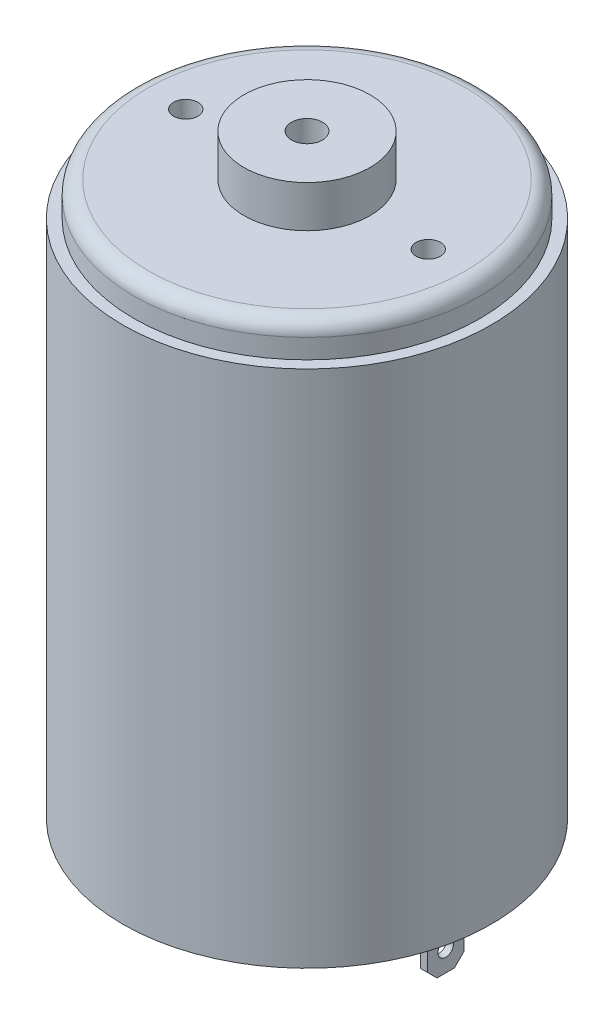
ISO-10303-21;
HEADER;
FILE_DESCRIPTION(('STEP AP214'),'2;1');
FILE_NAME('part.step','',(''),(''),'','','');
FILE_SCHEMA(('AUTOMOTIVE_DESIGN { 1 0 10303 214 1 1 1 1 }'));
ENDSEC;
DATA;
#1=APPLICATION_CONTEXT('core data for automotive mechanical design processes');
#2=APPLICATION_PROTOCOL_DEFINITION('international standard','automotive_design',2000,#1);
#3=PRODUCT_CONTEXT('',#1,'mechanical');
#4=PRODUCT('Part','Part','',(#3));
#5=PRODUCT_RELATED_PRODUCT_CATEGORY('part','',(#4));
#6=PRODUCT_DEFINITION_FORMATION('','',#4);
#7=PRODUCT_DEFINITION_CONTEXT('part definition',#1,'design');
#8=PRODUCT_DEFINITION('design','',#6,#7);
#9=PRODUCT_DEFINITION_SHAPE('','',#8);
#10=(LENGTH_UNIT() NAMED_UNIT(*) SI_UNIT(.MILLI.,.METRE.));
#11=(NAMED_UNIT(*) PLANE_ANGLE_UNIT() SI_UNIT($,.RADIAN.));
#12=(NAMED_UNIT(*) SI_UNIT($,.STERADIAN.) SOLID_ANGLE_UNIT());
#13=UNCERTAINTY_MEASURE_WITH_UNIT(LENGTH_MEASURE(1.E-05),#10,'distance_accuracy_value','');
#14=(GEOMETRIC_REPRESENTATION_CONTEXT(3) GLOBAL_UNCERTAINTY_ASSIGNED_CONTEXT((#13)) GLOBAL_UNIT_ASSIGNED_CONTEXT((#10,
#11,#12)) REPRESENTATION_CONTEXT('',''));
#15=CARTESIAN_POINT('',(0.,0.,0.));
#16=DIRECTION('',(0.,0.,1.));
#17=DIRECTION('',(1.,0.,0.));
#18=AXIS2_PLACEMENT_3D('',#15,#16,#17);
#19=CARTESIAN_POINT('',(-5.075,4.5,0.));
#20=DIRECTION('',(0.,1.,0.));
#21=DIRECTION('',(0.,0.,1.));
#22=AXIS2_PLACEMENT_3D('',#19,#20,#21);
#23=PLANE('',#22);
#24=DIRECTION('',(0.,0.,-1.));
#25=VECTOR('',#24,1.);
#26=CARTESIAN_POINT('',(-14.3,4.5,1.9));
#27=LINE('',#26,#25);
#28=CARTESIAN_POINT('',(-14.3,4.5,1.9));
#29=VERTEX_POINT('',#28);
#30=CARTESIAN_POINT('',(-14.3,4.5,-1.9));
#31=VERTEX_POINT('',#30);
#32=EDGE_CURVE('E181',#29,#31,#27,.T.);
#33=ORIENTED_EDGE('',*,*,#32,.F.);
#34=DIRECTION('',(-1.,0.,0.));
#35=VECTOR('',#34,1.);
#36=CARTESIAN_POINT('',(-14.3,4.5,1.9));
#37=LINE('',#36,#35);
#38=CARTESIAN_POINT('',(-13.6,4.5,1.9));
#39=VERTEX_POINT('',#38);
#40=EDGE_CURVE('E177',#39,#29,#37,.T.);
#41=ORIENTED_EDGE('',*,*,#40,.F.);
#42=DIRECTION('',(0.,0.,1.));
#43=VECTOR('',#42,1.);
#44=CARTESIAN_POINT('',(-13.6,4.5,1.9));
#45=LINE('',#44,#43);
#46=CARTESIAN_POINT('',(-13.6,4.5,-1.9));
#47=VERTEX_POINT('',#46);
#48=EDGE_CURVE('E187',#47,#39,#45,.T.);
#49=ORIENTED_EDGE('',*,*,#48,.F.);
#50=DIRECTION('',(1.,0.,0.));
#51=VECTOR('',#50,1.);
#52=CARTESIAN_POINT('',(-14.3,4.5,-1.9));
#53=LINE('',#52,#51);
#54=EDGE_CURVE('E184',#31,#47,#53,.T.);
#55=ORIENTED_EDGE('',*,*,#54,.F.);
#56=EDGE_LOOP('',(#33,#41,#49,#55));
#57=FACE_BOUND('',#56,.T.);
#58=CARTESIAN_POINT('',(0.,4.5,0.));
#59=DIRECTION('',(0.,-1.,0.));
#60=DIRECTION('',(0.,0.,-1.));
#61=AXIS2_PLACEMENT_3D('',#58,#59,#60);
#62=CIRCLE('',#61,5.075);
#63=CARTESIAN_POINT('',(0.,4.5,-5.075));
#64=VERTEX_POINT('',#63);
#65=EDGE_CURVE('E232',#64,#64,#62,.T.);
#66=ORIENTED_EDGE('',*,*,#65,.F.);
#67=EDGE_LOOP('',(#66));
#68=FACE_BOUND('',#67,.T.);
#69=CARTESIAN_POINT('',(0.,4.5,0.));
#70=DIRECTION('',(0.,-1.,0.));
#71=DIRECTION('',(0.,0.,-1.));
#72=AXIS2_PLACEMENT_3D('',#69,#70,#71);
#73=CIRCLE('',#72,19.);
#74=CARTESIAN_POINT('',(0.,4.5,-19.));
#75=VERTEX_POINT('',#74);
#76=EDGE_CURVE('E229',#75,#75,#73,.T.);
#77=ORIENTED_EDGE('',*,*,#76,.T.);
#78=EDGE_LOOP('',(#77));
#79=FACE_BOUND('',#78,.T.);
#80=DIRECTION('',(0.,0.,1.));
#81=VECTOR('',#80,1.);
#82=CARTESIAN_POINT('',(14.3,4.5,-1.9));
#83=LINE('',#82,#81);
#84=CARTESIAN_POINT('',(14.3,4.5,-1.9));
#85=VERTEX_POINT('',#84);
#86=CARTESIAN_POINT('',(14.3,4.5,1.9));
#87=VERTEX_POINT('',#86);
#88=EDGE_CURVE('E140',#85,#87,#83,.T.);
#89=ORIENTED_EDGE('',*,*,#88,.F.);
#90=DIRECTION('',(1.,0.,0.));
#91=VECTOR('',#90,1.);
#92=CARTESIAN_POINT('',(14.3,4.5,-1.9));
#93=LINE('',#92,#91);
#94=CARTESIAN_POINT('',(13.6,4.5,-1.9));
#95=VERTEX_POINT('',#94);
#96=EDGE_CURVE('E150',#95,#85,#93,.T.);
#97=ORIENTED_EDGE('',*,*,#96,.F.);
#98=DIRECTION('',(0.,0.,-1.));
#99=VECTOR('',#98,1.);
#100=CARTESIAN_POINT('',(13.6,4.5,-1.9));
#101=LINE('',#100,#99);
#102=CARTESIAN_POINT('',(13.6,4.5,1.9));
#103=VERTEX_POINT('',#102);
#104=EDGE_CURVE('E157',#103,#95,#101,.T.);
#105=ORIENTED_EDGE('',*,*,#104,.F.);
#106=DIRECTION('',(-1.,0.,0.));
#107=VECTOR('',#106,1.);
#108=CARTESIAN_POINT('',(14.3,4.5,1.9));
#109=LINE('',#108,#107);
#110=EDGE_CURVE('E153',#87,#103,#109,.T.);
#111=ORIENTED_EDGE('',*,*,#110,.F.);
#112=EDGE_LOOP('',(#89,#97,#105,#111));
#113=FACE_BOUND('',#112,.T.);
#114=ADVANCED_FACE('F40',(#57,#68,#79,#113),#23,.F.);
#115=CARTESIAN_POINT('',(-1.6,2.6,0.));
#116=DIRECTION('',(0.,1.,0.));
#117=DIRECTION('',(0.,0.,1.));
#118=AXIS2_PLACEMENT_3D('',#115,#116,#117);
#119=PLANE('',#118);
#120=CARTESIAN_POINT('',(0.,2.6,0.));
#121=DIRECTION('',(0.,1.,0.));
#122=DIRECTION('',(0.,0.,1.));
#123=AXIS2_PLACEMENT_3D('',#120,#121,#122);
#124=CIRCLE('',#123,1.6);
#125=CARTESIAN_POINT('',(0.,2.6,1.6));
#126=VERTEX_POINT('',#125);
#127=EDGE_CURVE('E415',#126,#126,#124,.T.);
#128=ORIENTED_EDGE('',*,*,#127,.T.);
#129=EDGE_LOOP('',(#128));
#130=FACE_BOUND('',#129,.T.);
#131=CARTESIAN_POINT('',(0.,2.6,0.));
#132=DIRECTION('',(0.,-1.,0.));
#133=DIRECTION('',(0.,0.,-1.));
#134=AXIS2_PLACEMENT_3D('',#131,#132,#133);
#135=CIRCLE('',#134,5.075);
#136=CARTESIAN_POINT('',(0.,2.6,-5.075));
#137=VERTEX_POINT('',#136);
#138=EDGE_CURVE('E235',#137,#137,#135,.T.);
#139=ORIENTED_EDGE('',*,*,#138,.T.);
#140=EDGE_LOOP('',(#139));
#141=FACE_BOUND('',#140,.T.);
#142=ADVANCED_FACE('F289',(#130,#141),#119,.F.);
#143=CARTESIAN_POINT('',(0.,0.,0.));
#144=DIRECTION('',(0.,-1.,0.));
#145=DIRECTION('',(0.,0.,-1.));
#146=AXIS2_PLACEMENT_3D('',#143,#144,#145);
#147=CYLINDRICAL_SURFACE('',#146,5.075);
#148=ORIENTED_EDGE('',*,*,#138,.F.);
#149=EDGE_LOOP('',(#148));
#150=FACE_BOUND('',#149,.T.);
#151=ORIENTED_EDGE('',*,*,#65,.T.);
#152=EDGE_LOOP('',(#151));
#153=FACE_BOUND('',#152,.T.);
#154=ADVANCED_FACE('F295',(#150,#153),#147,.T.);
#155=CARTESIAN_POINT('',(0.,0.,0.));
#156=DIRECTION('',(0.,-1.,0.));
#157=DIRECTION('',(0.,0.,-1.));
#158=AXIS2_PLACEMENT_3D('',#155,#156,#157);
#159=CYLINDRICAL_SURFACE('',#158,19.);
#160=ORIENTED_EDGE('',*,*,#76,.F.);
#161=EDGE_LOOP('',(#160));
#162=FACE_BOUND('',#161,.T.);
#163=CARTESIAN_POINT('',(0.,58.,0.));
#164=DIRECTION('',(0.,-1.,0.));
#165=DIRECTION('',(0.,0.,-1.));
#166=AXIS2_PLACEMENT_3D('',#163,#164,#165);
#167=CIRCLE('',#166,19.);
#168=CARTESIAN_POINT('',(0.,58.,-19.));
#169=VERTEX_POINT('',#168);
#170=EDGE_CURVE('E226',#169,#169,#167,.T.);
#171=ORIENTED_EDGE('',*,*,#170,.T.);
#172=EDGE_LOOP('',(#171));
#173=FACE_BOUND('',#172,.T.);
#174=ADVANCED_FACE('F302',(#162,#173),#159,.T.);
#175=CARTESIAN_POINT('',(-19.,58.,0.));
#176=DIRECTION('',(0.,-1.,0.));
#177=DIRECTION('',(0.,0.,-1.));
#178=AXIS2_PLACEMENT_3D('',#175,#176,#177);
#179=PLANE('',#178);
#180=ORIENTED_EDGE('',*,*,#170,.F.);
#181=EDGE_LOOP('',(#180));
#182=FACE_BOUND('',#181,.T.);
#183=CARTESIAN_POINT('',(0.,58.,0.));
#184=DIRECTION('',(0.,-1.,0.));
#185=DIRECTION('',(0.,0.,-1.));
#186=AXIS2_PLACEMENT_3D('',#183,#184,#185);
#187=CIRCLE('',#186,17.85);
#188=CARTESIAN_POINT('',(0.,58.,-17.85));
#189=VERTEX_POINT('',#188);
#190=EDGE_CURVE('E223',#189,#189,#187,.T.);
#191=ORIENTED_EDGE('',*,*,#190,.T.);
#192=EDGE_LOOP('',(#191));
#193=FACE_BOUND('',#192,.T.);
#194=ADVANCED_FACE('F390',(#182,#193),#179,.F.);
#195=CARTESIAN_POINT('',(0.,0.,0.));
#196=DIRECTION('',(0.,-1.,0.));
#197=DIRECTION('',(0.,0.,-1.));
#198=AXIS2_PLACEMENT_3D('',#195,#196,#197);
#199=CYLINDRICAL_SURFACE('',#198,17.85);
#200=ORIENTED_EDGE('',*,*,#190,.F.);
#201=EDGE_LOOP('',(#200));
#202=FACE_BOUND('',#201,.T.);
#203=CARTESIAN_POINT('',(0.,60.,0.));
#204=DIRECTION('',(0.,-1.,0.));
#205=DIRECTION('',(0.,0.,-1.));
#206=AXIS2_PLACEMENT_3D('',#203,#204,#205);
#207=CIRCLE('',#206,17.85);
#208=CARTESIAN_POINT('',(0.,60.,-17.85));
#209=VERTEX_POINT('',#208);
#210=EDGE_CURVE('E220',#209,#209,#207,.T.);
#211=ORIENTED_EDGE('',*,*,#210,.T.);
#212=EDGE_LOOP('',(#211));
#213=FACE_BOUND('',#212,.T.);
#214=ADVANCED_FACE('F387',(#202,#213),#199,.T.);
#215=CARTESIAN_POINT('',(0.,60.,0.));
#216=DIRECTION('',(0.,-1.,0.));
#217=DIRECTION('',(0.,0.,-1.));
#218=AXIS2_PLACEMENT_3D('',#215,#216,#217);
#219=TOROIDAL_SURFACE('',#218,16.35,1.5);
#220=ORIENTED_EDGE('',*,*,#210,.F.);
#221=EDGE_LOOP('',(#220));
#222=FACE_BOUND('',#221,.T.);
#223=CARTESIAN_POINT('',(0.,61.5,0.));
#224=DIRECTION('',(0.,-1.,0.));
#225=DIRECTION('',(0.,0.,-1.));
#226=AXIS2_PLACEMENT_3D('',#223,#224,#225);
#227=CIRCLE('',#226,16.35);
#228=CARTESIAN_POINT('',(0.,61.5,-16.35));
#229=VERTEX_POINT('',#228);
#230=EDGE_CURVE('E217',#229,#229,#227,.T.);
#231=ORIENTED_EDGE('',*,*,#230,.T.);
#232=EDGE_LOOP('',(#231));
#233=FACE_BOUND('',#232,.T.);
#234=ADVANCED_FACE('F383',(#222,#233),#219,.T.);
#235=CARTESIAN_POINT('',(-16.35,61.5,0.));
#236=DIRECTION('',(0.,-1.,0.));
#237=DIRECTION('',(0.,0.,-1.));
#238=AXIS2_PLACEMENT_3D('',#235,#236,#237);
#239=PLANE('',#238);
#240=CARTESIAN_POINT('',(-12.5,61.5,0.));
#241=DIRECTION('',(0.,1.,0.));
#242=DIRECTION('',(0.,0.,1.));
#243=AXIS2_PLACEMENT_3D('',#240,#241,#242);
#244=CIRCLE('',#243,1.25);
#245=CARTESIAN_POINT('',(-12.5,61.5,1.25));
#246=VERTEX_POINT('',#245);
#247=EDGE_CURVE('E199',#246,#246,#244,.T.);
#248=ORIENTED_EDGE('',*,*,#247,.F.);
#249=EDGE_LOOP('',(#248));
#250=FACE_BOUND('',#249,.T.);
#251=CARTESIAN_POINT('',(12.5,61.5,0.));
#252=DIRECTION('',(0.,1.,0.));
#253=DIRECTION('',(0.,0.,1.));
#254=AXIS2_PLACEMENT_3D('',#251,#252,#253);
#255=CIRCLE('',#254,1.25);
#256=CARTESIAN_POINT('',(12.5,61.5,1.24999999999999));
#257=VERTEX_POINT('',#256);
#258=EDGE_CURVE('E205',#257,#257,#255,.T.);
#259=ORIENTED_EDGE('',*,*,#258,.F.);
#260=EDGE_LOOP('',(#259));
#261=FACE_BOUND('',#260,.T.);
#262=ORIENTED_EDGE('',*,*,#230,.F.);
#263=EDGE_LOOP('',(#262));
#264=FACE_BOUND('',#263,.T.);
#265=CARTESIAN_POINT('',(0.,61.5,0.));
#266=DIRECTION('',(0.,-1.,0.));
#267=DIRECTION('',(0.,0.,-1.));
#268=AXIS2_PLACEMENT_3D('',#265,#266,#267);
#269=CIRCLE('',#268,6.5);
#270=CARTESIAN_POINT('',(0.,61.5,-6.5));
#271=VERTEX_POINT('',#270);
#272=EDGE_CURVE('E214',#271,#271,#269,.T.);
#273=ORIENTED_EDGE('',*,*,#272,.T.);
#274=EDGE_LOOP('',(#273));
#275=FACE_BOUND('',#274,.T.);
#276=ADVANCED_FACE('F379',(#250,#261,#264,#275),#239,.F.);
#277=CARTESIAN_POINT('',(0.,0.,0.));
#278=DIRECTION('',(0.,-1.,0.));
#279=DIRECTION('',(0.,0.,-1.));
#280=AXIS2_PLACEMENT_3D('',#277,#278,#279);
#281=CYLINDRICAL_SURFACE('',#280,6.5);
#282=ORIENTED_EDGE('',*,*,#272,.F.);
#283=EDGE_LOOP('',(#282));
#284=FACE_BOUND('',#283,.T.);
#285=CARTESIAN_POINT('',(0.,65.8,0.));
#286=DIRECTION('',(0.,-1.,0.));
#287=DIRECTION('',(0.,0.,-1.));
#288=AXIS2_PLACEMENT_3D('',#285,#286,#287);
#289=CIRCLE('',#288,6.5);
#290=CARTESIAN_POINT('',(0.,65.8,-6.5));
#291=VERTEX_POINT('',#290);
#292=EDGE_CURVE('E211',#291,#291,#289,.T.);
#293=ORIENTED_EDGE('',*,*,#292,.T.);
#294=EDGE_LOOP('',(#293));
#295=FACE_BOUND('',#294,.T.);
#296=ADVANCED_FACE('F375',(#284,#295),#281,.T.);
#297=CARTESIAN_POINT('',(-6.5,65.8,0.));
#298=DIRECTION('',(0.,-1.,0.));
#299=DIRECTION('',(0.,0.,-1.));
#300=AXIS2_PLACEMENT_3D('',#297,#298,#299);
#301=PLANE('',#300);
#302=ORIENTED_EDGE('',*,*,#292,.F.);
#303=EDGE_LOOP('',(#302));
#304=FACE_BOUND('',#303,.T.);
#305=CARTESIAN_POINT('',(0.,65.8,0.));
#306=DIRECTION('',(0.,-1.,0.));
#307=DIRECTION('',(0.,0.,-1.));
#308=AXIS2_PLACEMENT_3D('',#305,#306,#307);
#309=CIRCLE('',#308,1.6);
#310=CARTESIAN_POINT('',(0.,65.8,-1.6));
#311=VERTEX_POINT('',#310);
#312=EDGE_CURVE('E413',#311,#311,#309,.T.);
#313=ORIENTED_EDGE('',*,*,#312,.T.);
#314=EDGE_LOOP('',(#313));
#315=FACE_BOUND('',#314,.T.);
#316=ADVANCED_FACE('F371',(#304,#315),#301,.F.);
#317=CARTESIAN_POINT('',(12.5,53.,0.));
#318=DIRECTION('',(0.,1.,0.));
#319=DIRECTION('',(0.,0.,1.));
#320=AXIS2_PLACEMENT_3D('',#317,#318,#319);
#321=CONICAL_SURFACE('',#320,1.25,1.02974425867665);
#322=CARTESIAN_POINT('',(12.5,52.2489242262155,0.));
#323=VERTEX_POINT('',#322);
#324=VERTEX_LOOP('',#323);
#325=FACE_BOUND('',#324,.T.);
#326=CARTESIAN_POINT('',(12.5,53.,0.));
#327=DIRECTION('',(0.,1.,0.));
#328=DIRECTION('',(0.,0.,1.));
#329=AXIS2_PLACEMENT_3D('',#326,#327,#328);
#330=CIRCLE('',#329,1.25);
#331=CARTESIAN_POINT('',(12.5,53.,1.24999999999999));
#332=VERTEX_POINT('',#331);
#333=EDGE_CURVE('E208',#332,#332,#330,.T.);
#334=ORIENTED_EDGE('',*,*,#333,.T.);
#335=EDGE_LOOP('',(#334));
#336=FACE_BOUND('',#335,.T.);
#337=ADVANCED_FACE('F367',(#325,#336),#321,.F.);
#338=CARTESIAN_POINT('',(12.5,61.5,0.));
#339=DIRECTION('',(0.,1.,0.));
#340=DIRECTION('',(0.,0.,1.));
#341=AXIS2_PLACEMENT_3D('',#338,#339,#340);
#342=CYLINDRICAL_SURFACE('',#341,1.25);
#343=ORIENTED_EDGE('',*,*,#333,.F.);
#344=EDGE_LOOP('',(#343));
#345=FACE_BOUND('',#344,.T.);
#346=ORIENTED_EDGE('',*,*,#258,.T.);
#347=EDGE_LOOP('',(#346));
#348=FACE_BOUND('',#347,.T.);
#349=ADVANCED_FACE('F363',(#345,#348),#342,.F.);
#350=CARTESIAN_POINT('',(-12.5,53.,0.));
#351=DIRECTION('',(0.,1.,0.));
#352=DIRECTION('',(0.,0.,1.));
#353=AXIS2_PLACEMENT_3D('',#350,#351,#352);
#354=CONICAL_SURFACE('',#353,1.25,1.02974425867665);
#355=CARTESIAN_POINT('',(-12.5,52.2489242262155,0.));
#356=VERTEX_POINT('',#355);
#357=VERTEX_LOOP('',#356);
#358=FACE_BOUND('',#357,.T.);
#359=CARTESIAN_POINT('',(-12.5,53.,0.));
#360=DIRECTION('',(0.,1.,0.));
#361=DIRECTION('',(0.,0.,1.));
#362=AXIS2_PLACEMENT_3D('',#359,#360,#361);
#363=CIRCLE('',#362,1.25);
#364=CARTESIAN_POINT('',(-12.5,53.,1.25));
#365=VERTEX_POINT('',#364);
#366=EDGE_CURVE('E202',#365,#365,#363,.T.);
#367=ORIENTED_EDGE('',*,*,#366,.T.);
#368=EDGE_LOOP('',(#367));
#369=FACE_BOUND('',#368,.T.);
#370=ADVANCED_FACE('F359',(#358,#369),#354,.F.);
#371=CARTESIAN_POINT('',(-12.5,61.5,0.));
#372=DIRECTION('',(0.,1.,0.));
#373=DIRECTION('',(0.,0.,1.));
#374=AXIS2_PLACEMENT_3D('',#371,#372,#373);
#375=CYLINDRICAL_SURFACE('',#374,1.25);
#376=ORIENTED_EDGE('',*,*,#366,.F.);
#377=EDGE_LOOP('',(#376));
#378=FACE_BOUND('',#377,.T.);
#379=ORIENTED_EDGE('',*,*,#247,.T.);
#380=EDGE_LOOP('',(#379));
#381=FACE_BOUND('',#380,.T.);
#382=ADVANCED_FACE('F352',(#378,#381),#375,.F.);
#383=CARTESIAN_POINT('',(-14.3,-2.2,1.9));
#384=DIRECTION('',(1.,0.,0.));
#385=DIRECTION('',(0.,0.,-1.));
#386=AXIS2_PLACEMENT_3D('',#383,#384,#385);
#387=PLANE('',#386);
#388=CARTESIAN_POINT('',(-14.3,0.,0.));
#389=DIRECTION('',(-1.,0.,0.));
#390=DIRECTION('',(0.,0.,1.));
#391=AXIS2_PLACEMENT_3D('',#388,#389,#390);
#392=CIRCLE('',#391,0.8);
#393=CARTESIAN_POINT('',(-14.3,0.,0.8));
#394=VERTEX_POINT('',#393);
#395=EDGE_CURVE('E169',#394,#394,#392,.T.);
#396=ORIENTED_EDGE('',*,*,#395,.F.);
#397=EDGE_LOOP('',(#396));
#398=FACE_BOUND('',#397,.T.);
#399=DIRECTION('',(0.,0.,-1.));
#400=VECTOR('',#399,1.);
#401=CARTESIAN_POINT('',(-14.3,-2.2,1.9));
#402=LINE('',#401,#400);
#403=CARTESIAN_POINT('',(-14.3,-2.2,0.899999999999999));
#404=VERTEX_POINT('',#403);
#405=CARTESIAN_POINT('',(-14.3,-2.2,-0.899999999999998));
#406=VERTEX_POINT('',#405);
#407=EDGE_CURVE('E173',#404,#406,#402,.T.);
#408=ORIENTED_EDGE('',*,*,#407,.F.);
#409=DIRECTION('',(0.,0.707106781186548,0.707106781186548));
#410=VECTOR('',#409,1.);
#411=CARTESIAN_POINT('',(-14.3,-2.2,0.899999999999999));
#412=LINE('',#411,#410);
#413=CARTESIAN_POINT('',(-14.3,-1.2,1.9));
#414=VERTEX_POINT('',#413);
#415=EDGE_CURVE('E246',#404,#414,#412,.T.);
#416=ORIENTED_EDGE('',*,*,#415,.T.);
#417=DIRECTION('',(0.,1.,0.));
#418=VECTOR('',#417,1.);
#419=CARTESIAN_POINT('',(-14.3,-2.2,1.9));
#420=LINE('',#419,#418);
#421=EDGE_CURVE('E180',#414,#29,#420,.T.);
#422=ORIENTED_EDGE('',*,*,#421,.T.);
#423=ORIENTED_EDGE('',*,*,#32,.T.);
#424=DIRECTION('',(0.,1.,0.));
#425=VECTOR('',#424,1.);
#426=CARTESIAN_POINT('',(-14.3,-2.2,-1.9));
#427=LINE('',#426,#425);
#428=CARTESIAN_POINT('',(-14.3,-1.2,-1.9));
#429=VERTEX_POINT('',#428);
#430=EDGE_CURVE('E197',#429,#31,#427,.T.);
#431=ORIENTED_EDGE('',*,*,#430,.F.);
#432=DIRECTION('',(0.,-0.707106781186548,0.707106781186548));
#433=VECTOR('',#432,1.);
#434=CARTESIAN_POINT('',(-14.3,-2.2,-0.899999999999999));
#435=LINE('',#434,#433);
#436=EDGE_CURVE('E244',#429,#406,#435,.T.);
#437=ORIENTED_EDGE('',*,*,#436,.T.);
#438=EDGE_LOOP('',(#408,#416,#422,#423,#431,#437));
#439=FACE_BOUND('',#438,.T.);
#440=ADVANCED_FACE('F326',(#398,#439),#387,.F.);
#441=CARTESIAN_POINT('',(-14.3,-2.2,-1.9));
#442=DIRECTION('',(0.,0.,1.));
#443=DIRECTION('',(1.,0.,0.));
#444=AXIS2_PLACEMENT_3D('',#441,#442,#443);
#445=PLANE('',#444);
#446=DIRECTION('',(0.,1.,0.));
#447=VECTOR('',#446,1.);
#448=CARTESIAN_POINT('',(-13.6,-2.2,-1.9));
#449=LINE('',#448,#447);
#450=CARTESIAN_POINT('',(-13.6,-1.2,-1.9));
#451=VERTEX_POINT('',#450);
#452=EDGE_CURVE('E195',#451,#47,#449,.T.);
#453=ORIENTED_EDGE('',*,*,#452,.F.);
#454=DIRECTION('',(-1.,0.,0.));
#455=VECTOR('',#454,1.);
#456=CARTESIAN_POINT('',(-14.3,-1.2,-1.9));
#457=LINE('',#456,#455);
#458=EDGE_CURVE('E254',#451,#429,#457,.T.);
#459=ORIENTED_EDGE('',*,*,#458,.T.);
#460=ORIENTED_EDGE('',*,*,#430,.T.);
#461=ORIENTED_EDGE('',*,*,#54,.T.);
#462=EDGE_LOOP('',(#453,#459,#460,#461));
#463=FACE_BOUND('',#462,.T.);
#464=ADVANCED_FACE('F343',(#463),#445,.F.);
#465=CARTESIAN_POINT('',(-13.6,-2.2,1.9));
#466=DIRECTION('',(-1.,0.,0.));
#467=DIRECTION('',(0.,0.,1.));
#468=AXIS2_PLACEMENT_3D('',#465,#466,#467);
#469=PLANE('',#468);
#470=CARTESIAN_POINT('',(-13.6,0.,0.));
#471=DIRECTION('',(-1.,0.,0.));
#472=DIRECTION('',(0.,0.,1.));
#473=AXIS2_PLACEMENT_3D('',#470,#471,#472);
#474=CIRCLE('',#473,0.8);
#475=CARTESIAN_POINT('',(-13.6,0.,0.8));
#476=VERTEX_POINT('',#475);
#477=EDGE_CURVE('E172',#476,#476,#474,.T.);
#478=ORIENTED_EDGE('',*,*,#477,.T.);
#479=EDGE_LOOP('',(#478));
#480=FACE_BOUND('',#479,.T.);
#481=DIRECTION('',(0.,1.,0.));
#482=VECTOR('',#481,1.);
#483=CARTESIAN_POINT('',(-13.6,-2.2,1.9));
#484=LINE('',#483,#482);
#485=CARTESIAN_POINT('',(-13.6,-1.2,1.9));
#486=VERTEX_POINT('',#485);
#487=EDGE_CURVE('E193',#486,#39,#484,.T.);
#488=ORIENTED_EDGE('',*,*,#487,.F.);
#489=DIRECTION('',(0.,-0.707106781186548,-0.707106781186548));
#490=VECTOR('',#489,1.);
#491=CARTESIAN_POINT('',(-13.6,-2.2,0.899999999999999));
#492=LINE('',#491,#490);
#493=CARTESIAN_POINT('',(-13.6,-2.2,0.899999999999999));
#494=VERTEX_POINT('',#493);
#495=EDGE_CURVE('E252',#486,#494,#492,.T.);
#496=ORIENTED_EDGE('',*,*,#495,.T.);
#497=DIRECTION('',(0.,0.,1.));
#498=VECTOR('',#497,1.);
#499=CARTESIAN_POINT('',(-13.6,-2.2,1.9));
#500=LINE('',#499,#498);
#501=CARTESIAN_POINT('',(-13.6,-2.2,-0.899999999999998));
#502=VERTEX_POINT('',#501);
#503=EDGE_CURVE('E176',#502,#494,#500,.T.);
#504=ORIENTED_EDGE('',*,*,#503,.F.);
#505=DIRECTION('',(0.,0.707106781186548,-0.707106781186548));
#506=VECTOR('',#505,1.);
#507=CARTESIAN_POINT('',(-13.6,-2.2,-0.899999999999999));
#508=LINE('',#507,#506);
#509=EDGE_CURVE('E250',#502,#451,#508,.T.);
#510=ORIENTED_EDGE('',*,*,#509,.T.);
#511=ORIENTED_EDGE('',*,*,#452,.T.);
#512=ORIENTED_EDGE('',*,*,#48,.T.);
#513=EDGE_LOOP('',(#488,#496,#504,#510,#511,#512));
#514=FACE_BOUND('',#513,.T.);
#515=ADVANCED_FACE('F340',(#480,#514),#469,.F.);
#516=CARTESIAN_POINT('',(-14.3,-2.2,1.9));
#517=DIRECTION('',(0.,0.,-1.));
#518=DIRECTION('',(-1.,0.,0.));
#519=AXIS2_PLACEMENT_3D('',#516,#517,#518);
#520=PLANE('',#519);
#521=ORIENTED_EDGE('',*,*,#421,.F.);
#522=DIRECTION('',(1.,0.,0.));
#523=VECTOR('',#522,1.);
#524=CARTESIAN_POINT('',(-13.6,-1.2,1.9));
#525=LINE('',#524,#523);
#526=EDGE_CURVE('E248',#414,#486,#525,.T.);
#527=ORIENTED_EDGE('',*,*,#526,.T.);
#528=ORIENTED_EDGE('',*,*,#487,.T.);
#529=ORIENTED_EDGE('',*,*,#40,.T.);
#530=EDGE_LOOP('',(#521,#527,#528,#529));
#531=FACE_BOUND('',#530,.T.);
#532=ADVANCED_FACE('F334',(#531),#520,.F.);
#533=CARTESIAN_POINT('',(-14.3,-2.2,-1.9));
#534=DIRECTION('',(0.,-1.,0.));
#535=DIRECTION('',(0.,0.,-1.));
#536=AXIS2_PLACEMENT_3D('',#533,#534,#535);
#537=PLANE('',#536);
#538=ORIENTED_EDGE('',*,*,#503,.T.);
#539=DIRECTION('',(-1.,0.,0.));
#540=VECTOR('',#539,1.);
#541=CARTESIAN_POINT('',(-14.3,-2.2,0.899999999999999));
#542=LINE('',#541,#540);
#543=EDGE_CURVE('E241',#494,#404,#542,.T.);
#544=ORIENTED_EDGE('',*,*,#543,.T.);
#545=ORIENTED_EDGE('',*,*,#407,.T.);
#546=DIRECTION('',(1.,0.,0.));
#547=VECTOR('',#546,1.);
#548=CARTESIAN_POINT('',(-13.6,-2.2,-0.899999999999999));
#549=LINE('',#548,#547);
#550=EDGE_CURVE('E238',#406,#502,#549,.T.);
#551=ORIENTED_EDGE('',*,*,#550,.T.);
#552=EDGE_LOOP('',(#538,#544,#545,#551));
#553=FACE_BOUND('',#552,.T.);
#554=ADVANCED_FACE('F310',(#553),#537,.T.);
#555=CARTESIAN_POINT('',(-14.3,-2.2,0.899999999999999));
#556=DIRECTION('',(0.,-0.707106781186547,0.707106781186547));
#557=DIRECTION('',(0.,-0.707106781186548,-0.707106781186548));
#558=AXIS2_PLACEMENT_3D('',#555,#556,#557);
#559=PLANE('',#558);
#560=ORIENTED_EDGE('',*,*,#495,.F.);
#561=ORIENTED_EDGE('',*,*,#526,.F.);
#562=ORIENTED_EDGE('',*,*,#415,.F.);
#563=ORIENTED_EDGE('',*,*,#543,.F.);
#564=EDGE_LOOP('',(#560,#561,#562,#563));
#565=FACE_BOUND('',#564,.T.);
#566=ADVANCED_FACE('F307',(#565),#559,.T.);
#567=CARTESIAN_POINT('',(-14.3,-2.2,-0.899999999999999));
#568=DIRECTION('',(0.,-0.707106781186547,-0.707106781186547));
#569=DIRECTION('',(0.,0.707106781186548,-0.707106781186548));
#570=AXIS2_PLACEMENT_3D('',#567,#568,#569);
#571=PLANE('',#570);
#572=ORIENTED_EDGE('',*,*,#436,.F.);
#573=ORIENTED_EDGE('',*,*,#458,.F.);
#574=ORIENTED_EDGE('',*,*,#509,.F.);
#575=ORIENTED_EDGE('',*,*,#550,.F.);
#576=EDGE_LOOP('',(#572,#573,#574,#575));
#577=FACE_BOUND('',#576,.T.);
#578=ADVANCED_FACE('F309',(#577),#571,.T.);
#579=CARTESIAN_POINT('',(-7.6,0.,0.));
#580=DIRECTION('',(-1.,0.,0.));
#581=DIRECTION('',(0.,0.,1.));
#582=AXIS2_PLACEMENT_3D('',#579,#580,#581);
#583=CYLINDRICAL_SURFACE('',#582,0.8);
#584=ORIENTED_EDGE('',*,*,#395,.T.);
#585=EDGE_LOOP('',(#584));
#586=FACE_BOUND('',#585,.T.);
#587=ORIENTED_EDGE('',*,*,#477,.F.);
#588=EDGE_LOOP('',(#587));
#589=FACE_BOUND('',#588,.T.);
#590=ADVANCED_FACE('F313',(#586,#589),#583,.F.);
#591=CARTESIAN_POINT('',(14.3,-2.2,-1.9));
#592=DIRECTION('',(-1.,0.,0.));
#593=DIRECTION('',(0.,0.,1.));
#594=AXIS2_PLACEMENT_3D('',#591,#592,#593);
#595=PLANE('',#594);
#596=CARTESIAN_POINT('',(14.3,0.,0.));
#597=DIRECTION('',(1.,0.,0.));
#598=DIRECTION('',(0.,0.,-1.));
#599=AXIS2_PLACEMENT_3D('',#596,#597,#598);
#600=CIRCLE('',#599,0.8);
#601=CARTESIAN_POINT('',(14.3,0.,-0.8));
#602=VERTEX_POINT('',#601);
#603=EDGE_CURVE('E418',#602,#602,#600,.T.);
#604=ORIENTED_EDGE('',*,*,#603,.F.);
#605=EDGE_LOOP('',(#604));
#606=FACE_BOUND('',#605,.T.);
#607=DIRECTION('',(0.,0.,1.));
#608=VECTOR('',#607,1.);
#609=CARTESIAN_POINT('',(14.3,-2.2,-1.9));
#610=LINE('',#609,#608);
#611=CARTESIAN_POINT('',(14.3,-2.2,-0.899999999999999));
#612=VERTEX_POINT('',#611);
#613=CARTESIAN_POINT('',(14.3,-2.2,0.899999999999998));
#614=VERTEX_POINT('',#613);
#615=EDGE_CURVE('E156',#612,#614,#610,.T.);
#616=ORIENTED_EDGE('',*,*,#615,.F.);
#617=DIRECTION('',(0.,0.707106781186548,-0.707106781186548));
#618=VECTOR('',#617,1.);
#619=CARTESIAN_POINT('',(14.3,-2.2,-0.899999999999999));
#620=LINE('',#619,#618);
#621=CARTESIAN_POINT('',(14.3,-1.2,-1.9));
#622=VERTEX_POINT('',#621);
#623=EDGE_CURVE('E141',#612,#622,#620,.T.);
#624=ORIENTED_EDGE('',*,*,#623,.T.);
#625=DIRECTION('',(0.,1.,0.));
#626=VECTOR('',#625,1.);
#627=CARTESIAN_POINT('',(14.3,-2.2,-1.9));
#628=LINE('',#627,#626);
#629=EDGE_CURVE('E135',#622,#85,#628,.T.);
#630=ORIENTED_EDGE('',*,*,#629,.T.);
#631=ORIENTED_EDGE('',*,*,#88,.T.);
#632=DIRECTION('',(0.,1.,0.));
#633=VECTOR('',#632,1.);
#634=CARTESIAN_POINT('',(14.3,-2.2,1.9));
#635=LINE('',#634,#633);
#636=CARTESIAN_POINT('',(14.3,-1.2,1.9));
#637=VERTEX_POINT('',#636);
#638=EDGE_CURVE('E167',#637,#87,#635,.T.);
#639=ORIENTED_EDGE('',*,*,#638,.F.);
#640=DIRECTION('',(0.,-0.707106781186548,-0.707106781186548));
#641=VECTOR('',#640,1.);
#642=CARTESIAN_POINT('',(14.3,-2.2,0.899999999999999));
#643=LINE('',#642,#641);
#644=EDGE_CURVE('E264',#637,#614,#643,.T.);
#645=ORIENTED_EDGE('',*,*,#644,.T.);
#646=EDGE_LOOP('',(#616,#624,#630,#631,#639,#645));
#647=FACE_BOUND('',#646,.T.);
#648=ADVANCED_FACE('F138',(#606,#647),#595,.F.);
#649=CARTESIAN_POINT('',(14.3,-2.2,1.9));
#650=DIRECTION('',(0.,0.,-1.));
#651=DIRECTION('',(-1.,0.,0.));
#652=AXIS2_PLACEMENT_3D('',#649,#650,#651);
#653=PLANE('',#652);
#654=DIRECTION('',(0.,1.,0.));
#655=VECTOR('',#654,1.);
#656=CARTESIAN_POINT('',(13.6,-2.2,1.9));
#657=LINE('',#656,#655);
#658=CARTESIAN_POINT('',(13.6,-1.2,1.9));
#659=VERTEX_POINT('',#658);
#660=EDGE_CURVE('E165',#659,#103,#657,.T.);
#661=ORIENTED_EDGE('',*,*,#660,.F.);
#662=DIRECTION('',(1.,0.,0.));
#663=VECTOR('',#662,1.);
#664=CARTESIAN_POINT('',(14.3,-1.2,1.9));
#665=LINE('',#664,#663);
#666=EDGE_CURVE('E11',#659,#637,#665,.T.);
#667=ORIENTED_EDGE('',*,*,#666,.T.);
#668=ORIENTED_EDGE('',*,*,#638,.T.);
#669=ORIENTED_EDGE('',*,*,#110,.T.);
#670=EDGE_LOOP('',(#661,#667,#668,#669));
#671=FACE_BOUND('',#670,.T.);
#672=ADVANCED_FACE('F423',(#671),#653,.F.);
#673=CARTESIAN_POINT('',(13.6,-2.2,-1.9));
#674=DIRECTION('',(1.,0.,0.));
#675=DIRECTION('',(0.,0.,-1.));
#676=AXIS2_PLACEMENT_3D('',#673,#674,#675);
#677=PLANE('',#676);
#678=CARTESIAN_POINT('',(13.6,0.,0.));
#679=DIRECTION('',(1.,0.,0.));
#680=DIRECTION('',(0.,0.,-1.));
#681=AXIS2_PLACEMENT_3D('',#678,#679,#680);
#682=CIRCLE('',#681,0.8);
#683=CARTESIAN_POINT('',(13.6,0.,-0.8));
#684=VERTEX_POINT('',#683);
#685=EDGE_CURVE('E44',#684,#684,#682,.T.);
#686=ORIENTED_EDGE('',*,*,#685,.T.);
#687=EDGE_LOOP('',(#686));
#688=FACE_BOUND('',#687,.T.);
#689=DIRECTION('',(0.,1.,0.));
#690=VECTOR('',#689,1.);
#691=CARTESIAN_POINT('',(13.6,-2.2,-1.9));
#692=LINE('',#691,#690);
#693=CARTESIAN_POINT('',(13.6,-1.2,-1.9));
#694=VERTEX_POINT('',#693);
#695=EDGE_CURVE('E143',#694,#95,#692,.T.);
#696=ORIENTED_EDGE('',*,*,#695,.F.);
#697=DIRECTION('',(0.,-0.707106781186548,0.707106781186548));
#698=VECTOR('',#697,1.);
#699=CARTESIAN_POINT('',(13.6,-2.2,-0.899999999999999));
#700=LINE('',#699,#698);
#701=CARTESIAN_POINT('',(13.6,-2.2,-0.899999999999999));
#702=VERTEX_POINT('',#701);
#703=EDGE_CURVE('E49',#694,#702,#700,.T.);
#704=ORIENTED_EDGE('',*,*,#703,.T.);
#705=DIRECTION('',(0.,0.,-1.));
#706=VECTOR('',#705,1.);
#707=CARTESIAN_POINT('',(13.6,-2.2,-1.9));
#708=LINE('',#707,#706);
#709=CARTESIAN_POINT('',(13.6,-2.2,0.899999999999998));
#710=VERTEX_POINT('',#709);
#711=EDGE_CURVE('E144',#710,#702,#708,.T.);
#712=ORIENTED_EDGE('',*,*,#711,.F.);
#713=DIRECTION('',(0.,0.707106781186548,0.707106781186548));
#714=VECTOR('',#713,1.);
#715=CARTESIAN_POINT('',(13.6,-2.2,0.899999999999999));
#716=LINE('',#715,#714);
#717=EDGE_CURVE('E56',#710,#659,#716,.T.);
#718=ORIENTED_EDGE('',*,*,#717,.T.);
#719=ORIENTED_EDGE('',*,*,#660,.T.);
#720=ORIENTED_EDGE('',*,*,#104,.T.);
#721=EDGE_LOOP('',(#696,#704,#712,#718,#719,#720));
#722=FACE_BOUND('',#721,.T.);
#723=ADVANCED_FACE('F271',(#688,#722),#677,.F.);
#724=CARTESIAN_POINT('',(14.3,-2.2,-1.9));
#725=DIRECTION('',(0.,0.,1.));
#726=DIRECTION('',(1.,0.,0.));
#727=AXIS2_PLACEMENT_3D('',#724,#725,#726);
#728=PLANE('',#727);
#729=ORIENTED_EDGE('',*,*,#629,.F.);
#730=DIRECTION('',(-1.,0.,0.));
#731=VECTOR('',#730,1.);
#732=CARTESIAN_POINT('',(13.6,-1.2,-1.9));
#733=LINE('',#732,#731);
#734=EDGE_CURVE('E64',#622,#694,#733,.T.);
#735=ORIENTED_EDGE('',*,*,#734,.T.);
#736=ORIENTED_EDGE('',*,*,#695,.T.);
#737=ORIENTED_EDGE('',*,*,#96,.T.);
#738=EDGE_LOOP('',(#729,#735,#736,#737));
#739=FACE_BOUND('',#738,.T.);
#740=ADVANCED_FACE('F155',(#739),#728,.F.);
#741=CARTESIAN_POINT('',(14.3,-2.2,1.9));
#742=DIRECTION('',(0.,-1.,0.));
#743=DIRECTION('',(0.,0.,1.));
#744=AXIS2_PLACEMENT_3D('',#741,#742,#743);
#745=PLANE('',#744);
#746=ORIENTED_EDGE('',*,*,#711,.T.);
#747=DIRECTION('',(1.,0.,0.));
#748=VECTOR('',#747,1.);
#749=CARTESIAN_POINT('',(14.3,-2.2,-0.899999999999999));
#750=LINE('',#749,#748);
#751=EDGE_CURVE('E261',#702,#612,#750,.T.);
#752=ORIENTED_EDGE('',*,*,#751,.T.);
#753=ORIENTED_EDGE('',*,*,#615,.T.);
#754=DIRECTION('',(-1.,0.,0.));
#755=VECTOR('',#754,1.);
#756=CARTESIAN_POINT('',(13.6,-2.2,0.899999999999999));
#757=LINE('',#756,#755);
#758=EDGE_CURVE('E256',#614,#710,#757,.T.);
#759=ORIENTED_EDGE('',*,*,#758,.T.);
#760=EDGE_LOOP('',(#746,#752,#753,#759));
#761=FACE_BOUND('',#760,.T.);
#762=ADVANCED_FACE('F275',(#761),#745,.T.);
#763=CARTESIAN_POINT('',(14.3,-2.2,-0.899999999999999));
#764=DIRECTION('',(0.,-0.707106781186547,-0.707106781186547));
#765=DIRECTION('',(0.,0.707106781186548,-0.707106781186548));
#766=AXIS2_PLACEMENT_3D('',#763,#764,#765);
#767=PLANE('',#766);
#768=ORIENTED_EDGE('',*,*,#703,.F.);
#769=ORIENTED_EDGE('',*,*,#734,.F.);
#770=ORIENTED_EDGE('',*,*,#623,.F.);
#771=ORIENTED_EDGE('',*,*,#751,.F.);
#772=EDGE_LOOP('',(#768,#769,#770,#771));
#773=FACE_BOUND('',#772,.T.);
#774=ADVANCED_FACE('F278',(#773),#767,.T.);
#775=CARTESIAN_POINT('',(14.3,-2.2,0.899999999999999));
#776=DIRECTION('',(0.,-0.707106781186547,0.707106781186547));
#777=DIRECTION('',(0.,-0.707106781186548,-0.707106781186548));
#778=AXIS2_PLACEMENT_3D('',#775,#776,#777);
#779=PLANE('',#778);
#780=ORIENTED_EDGE('',*,*,#644,.F.);
#781=ORIENTED_EDGE('',*,*,#666,.F.);
#782=ORIENTED_EDGE('',*,*,#717,.F.);
#783=ORIENTED_EDGE('',*,*,#758,.F.);
#784=EDGE_LOOP('',(#780,#781,#782,#783));
#785=FACE_BOUND('',#784,.T.);
#786=ADVANCED_FACE('F42',(#785),#779,.T.);
#787=CARTESIAN_POINT('',(7.6,0.,0.));
#788=DIRECTION('',(1.,0.,0.));
#789=DIRECTION('',(0.,0.,-1.));
#790=AXIS2_PLACEMENT_3D('',#787,#788,#789);
#791=CYLINDRICAL_SURFACE('',#790,0.8);
#792=ORIENTED_EDGE('',*,*,#603,.T.);
#793=EDGE_LOOP('',(#792));
#794=FACE_BOUND('',#793,.T.);
#795=ORIENTED_EDGE('',*,*,#685,.F.);
#796=EDGE_LOOP('',(#795));
#797=FACE_BOUND('',#796,.T.);
#798=ADVANCED_FACE('F284',(#794,#797),#791,.F.);
#799=CARTESIAN_POINT('',(0.,85.,0.));
#800=DIRECTION('',(0.,-1.,0.));
#801=DIRECTION('',(0.,0.,-1.));
#802=AXIS2_PLACEMENT_3D('',#799,#800,#801);
#803=CYLINDRICAL_SURFACE('',#802,1.6);
#804=ORIENTED_EDGE('',*,*,#312,.F.);
#805=EDGE_LOOP('',(#804));
#806=FACE_BOUND('',#805,.T.);
#807=ORIENTED_EDGE('',*,*,#127,.F.);
#808=EDGE_LOOP('',(#807));
#809=FACE_BOUND('',#808,.T.);
#810=ADVANCED_FACE('F526',(#806,#809),#803,.F.);
#811=CLOSED_SHELL('',(#114,#142,#154,#174,#194,#214,#234,#276,#296,#316,#337,#349,#370,#382,
#440,#464,#515,#532,#554,#566,#578,#590,#648,#672,#723,#740,#762,#774,#786,#798,#810));
#812=MANIFOLD_SOLID_BREP('B2',#811);
#813=ADVANCED_BREP_SHAPE_REPRESENTATION('',(#18,#812),#14);
#814=SHAPE_DEFINITION_REPRESENTATION(#9,#813);
ENDSEC;
END-ISO-10303-21;
